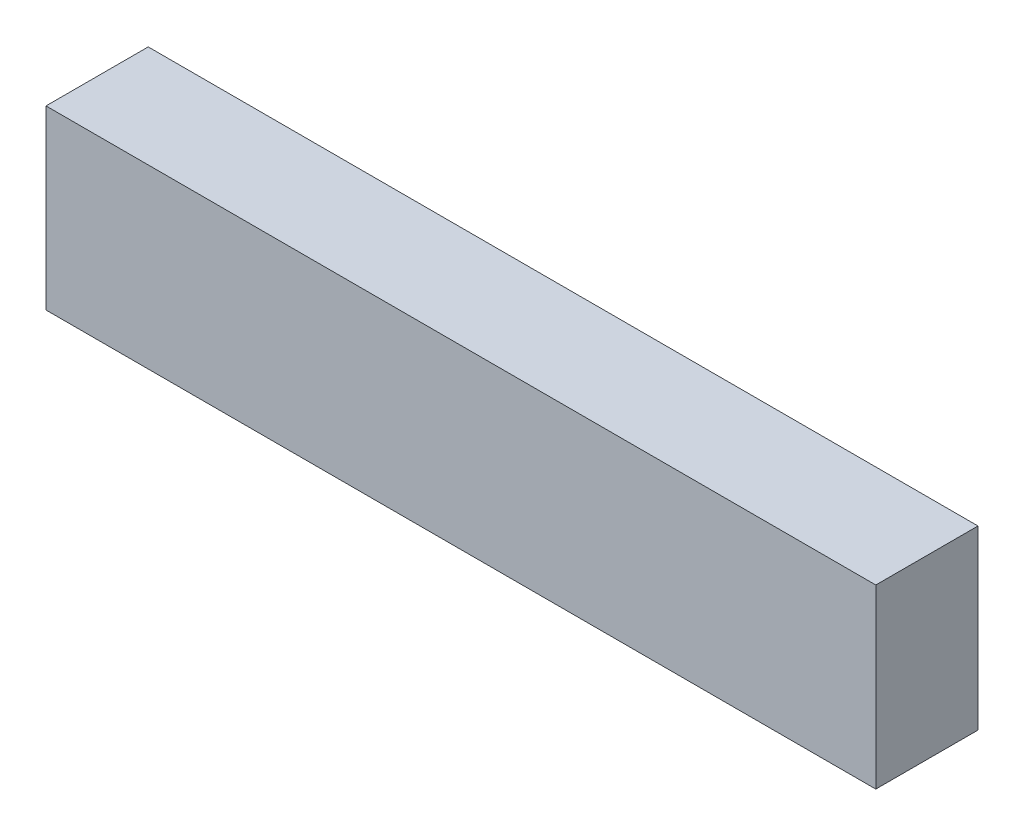
ISO-10303-21;
HEADER;
FILE_DESCRIPTION(('STEP AP214'),'2;1');
FILE_NAME('part.step','',(''),(''),'','','');
FILE_SCHEMA(('AUTOMOTIVE_DESIGN { 1 0 10303 214 1 1 1 1 }'));
ENDSEC;
DATA;
#1=APPLICATION_CONTEXT('core data for automotive mechanical design processes');
#2=APPLICATION_PROTOCOL_DEFINITION('international standard','automotive_design',2000,#1);
#3=PRODUCT_CONTEXT('',#1,'mechanical');
#4=PRODUCT('Part','Part','',(#3));
#5=PRODUCT_RELATED_PRODUCT_CATEGORY('part','',(#4));
#6=PRODUCT_DEFINITION_FORMATION('','',#4);
#7=PRODUCT_DEFINITION_CONTEXT('part definition',#1,'design');
#8=PRODUCT_DEFINITION('design','',#6,#7);
#9=PRODUCT_DEFINITION_SHAPE('','',#8);
#10=(LENGTH_UNIT() NAMED_UNIT(*) SI_UNIT(.MILLI.,.METRE.));
#11=(NAMED_UNIT(*) PLANE_ANGLE_UNIT() SI_UNIT($,.RADIAN.));
#12=(NAMED_UNIT(*) SI_UNIT($,.STERADIAN.) SOLID_ANGLE_UNIT());
#13=UNCERTAINTY_MEASURE_WITH_UNIT(LENGTH_MEASURE(1.E-05),#10,'distance_accuracy_value','');
#14=(GEOMETRIC_REPRESENTATION_CONTEXT(3) GLOBAL_UNCERTAINTY_ASSIGNED_CONTEXT((#13)) GLOBAL_UNIT_ASSIGNED_CONTEXT((#10,
#11,#12)) REPRESENTATION_CONTEXT('',''));
#15=CARTESIAN_POINT('',(0.,0.,0.));
#16=DIRECTION('',(0.,0.,1.));
#17=DIRECTION('',(1.,0.,0.));
#18=AXIS2_PLACEMENT_3D('',#15,#16,#17);
#19=CARTESIAN_POINT('',(-79.0368014902547,30.19,7.25));
#20=DIRECTION('',(1.,0.,0.));
#21=DIRECTION('',(0.,0.,-1.));
#22=AXIS2_PLACEMENT_3D('',#19,#20,#21);
#23=PLANE('',#22);
#24=DIRECTION('',(0.,-1.,0.));
#25=VECTOR('',#24,1.);
#26=CARTESIAN_POINT('',(-79.0368014902547,30.19,0.));
#27=LINE('',#26,#25);
#28=CARTESIAN_POINT('',(-79.0368014902547,30.19,0.));
#29=VERTEX_POINT('',#28);
#30=CARTESIAN_POINT('',(-79.0368014902547,17.65,0.));
#31=VERTEX_POINT('',#30);
#32=EDGE_CURVE('E149',#29,#31,#27,.T.);
#33=ORIENTED_EDGE('',*,*,#32,.T.);
#34=DIRECTION('',(0.,0.,-1.));
#35=VECTOR('',#34,1.);
#36=CARTESIAN_POINT('',(-79.0368014902547,17.65,7.25));
#37=LINE('',#36,#35);
#38=CARTESIAN_POINT('',(-79.0368014902547,17.65,7.25));
#39=VERTEX_POINT('',#38);
#40=EDGE_CURVE('E11',#39,#31,#37,.T.);
#41=ORIENTED_EDGE('',*,*,#40,.F.);
#42=DIRECTION('',(0.,-1.,0.));
#43=VECTOR('',#42,1.);
#44=CARTESIAN_POINT('',(-79.0368014902547,30.19,7.25));
#45=LINE('',#44,#43);
#46=CARTESIAN_POINT('',(-79.0368014902547,30.19,7.25));
#47=VERTEX_POINT('',#46);
#48=EDGE_CURVE('E140',#47,#39,#45,.T.);
#49=ORIENTED_EDGE('',*,*,#48,.F.);
#50=DIRECTION('',(0.,0.,-1.));
#51=VECTOR('',#50,1.);
#52=CARTESIAN_POINT('',(-79.0368014902547,30.19,7.25));
#53=LINE('',#52,#51);
#54=EDGE_CURVE('E55',#47,#29,#53,.T.);
#55=ORIENTED_EDGE('',*,*,#54,.T.);
#56=EDGE_LOOP('',(#33,#41,#49,#55));
#57=FACE_BOUND('',#56,.T.);
#58=ADVANCED_FACE('F32',(#57),#23,.F.);
#59=CARTESIAN_POINT('',(-79.0368014902547,17.65,7.25));
#60=DIRECTION('',(0.,1.,0.));
#61=DIRECTION('',(0.,0.,1.));
#62=AXIS2_PLACEMENT_3D('',#59,#60,#61);
#63=PLANE('',#62);
#64=DIRECTION('',(1.,0.,0.));
#65=VECTOR('',#64,1.);
#66=CARTESIAN_POINT('',(-79.0368014902547,17.65,0.));
#67=LINE('',#66,#65);
#68=CARTESIAN_POINT('',(-20.1754999999996,17.65,0.));
#69=VERTEX_POINT('',#68);
#70=EDGE_CURVE('E151',#31,#69,#67,.T.);
#71=ORIENTED_EDGE('',*,*,#70,.T.);
#72=DIRECTION('',(0.,0.,-1.));
#73=VECTOR('',#72,1.);
#74=CARTESIAN_POINT('',(-20.1754999999996,17.65,7.25));
#75=LINE('',#74,#73);
#76=CARTESIAN_POINT('',(-20.1754999999996,17.65,7.25));
#77=VERTEX_POINT('',#76);
#78=EDGE_CURVE('E39',#77,#69,#75,.T.);
#79=ORIENTED_EDGE('',*,*,#78,.F.);
#80=DIRECTION('',(1.,0.,0.));
#81=VECTOR('',#80,1.);
#82=CARTESIAN_POINT('',(-79.0368014902547,17.65,7.25));
#83=LINE('',#82,#81);
#84=EDGE_CURVE('E81',#39,#77,#83,.T.);
#85=ORIENTED_EDGE('',*,*,#84,.F.);
#86=ORIENTED_EDGE('',*,*,#40,.T.);
#87=EDGE_LOOP('',(#71,#79,#85,#86));
#88=FACE_BOUND('',#87,.T.);
#89=ADVANCED_FACE('F166',(#88),#63,.F.);
#90=CARTESIAN_POINT('',(-20.1754999999996,30.19,7.25));
#91=DIRECTION('',(1.,0.,0.));
#92=DIRECTION('',(0.,0.,-1.));
#93=AXIS2_PLACEMENT_3D('',#90,#91,#92);
#94=PLANE('',#93);
#95=DIRECTION('',(0.,-1.,0.));
#96=VECTOR('',#95,1.);
#97=CARTESIAN_POINT('',(-20.1754999999996,30.19,0.));
#98=LINE('',#97,#96);
#99=CARTESIAN_POINT('',(-20.1754999999996,30.19,0.));
#100=VERTEX_POINT('',#99);
#101=EDGE_CURVE('E155',#100,#69,#98,.T.);
#102=ORIENTED_EDGE('',*,*,#101,.F.);
#103=DIRECTION('',(0.,0.,-1.));
#104=VECTOR('',#103,1.);
#105=CARTESIAN_POINT('',(-20.1754999999996,30.19,7.25));
#106=LINE('',#105,#104);
#107=CARTESIAN_POINT('',(-20.1754999999996,30.19,7.25));
#108=VERTEX_POINT('',#107);
#109=EDGE_CURVE('E161',#108,#100,#106,.T.);
#110=ORIENTED_EDGE('',*,*,#109,.F.);
#111=DIRECTION('',(0.,-1.,0.));
#112=VECTOR('',#111,1.);
#113=CARTESIAN_POINT('',(-20.1754999999996,30.19,7.25));
#114=LINE('',#113,#112);
#115=EDGE_CURVE('E144',#108,#77,#114,.T.);
#116=ORIENTED_EDGE('',*,*,#115,.T.);
#117=ORIENTED_EDGE('',*,*,#78,.T.);
#118=EDGE_LOOP('',(#102,#110,#116,#117));
#119=FACE_BOUND('',#118,.T.);
#120=ADVANCED_FACE('F164',(#119),#94,.T.);
#121=CARTESIAN_POINT('',(-79.0368014902547,30.19,7.25));
#122=DIRECTION('',(0.,1.,0.));
#123=DIRECTION('',(0.,0.,1.));
#124=AXIS2_PLACEMENT_3D('',#121,#122,#123);
#125=PLANE('',#124);
#126=DIRECTION('',(1.,0.,0.));
#127=VECTOR('',#126,1.);
#128=CARTESIAN_POINT('',(-79.0368014902547,30.19,0.));
#129=LINE('',#128,#127);
#130=EDGE_CURVE('E142',#29,#100,#129,.T.);
#131=ORIENTED_EDGE('',*,*,#130,.F.);
#132=ORIENTED_EDGE('',*,*,#54,.F.);
#133=DIRECTION('',(1.,0.,0.));
#134=VECTOR('',#133,1.);
#135=CARTESIAN_POINT('',(-79.0368014902547,30.19,7.25));
#136=LINE('',#135,#134);
#137=EDGE_CURVE('E147',#47,#108,#136,.T.);
#138=ORIENTED_EDGE('',*,*,#137,.T.);
#139=ORIENTED_EDGE('',*,*,#109,.T.);
#140=EDGE_LOOP('',(#131,#132,#138,#139));
#141=FACE_BOUND('',#140,.T.);
#142=ADVANCED_FACE('F170',(#141),#125,.T.);
#143=CARTESIAN_POINT('',(0.,0.,7.25));
#144=DIRECTION('',(0.,0.,1.));
#145=DIRECTION('',(1.,0.,0.));
#146=AXIS2_PLACEMENT_3D('',#143,#144,#145);
#147=PLANE('',#146);
#148=ORIENTED_EDGE('',*,*,#48,.T.);
#149=ORIENTED_EDGE('',*,*,#84,.T.);
#150=ORIENTED_EDGE('',*,*,#115,.F.);
#151=ORIENTED_EDGE('',*,*,#137,.F.);
#152=EDGE_LOOP('',(#148,#149,#150,#151));
#153=FACE_BOUND('',#152,.T.);
#154=ADVANCED_FACE('F173',(#153),#147,.T.);
#155=CARTESIAN_POINT('',(0.,0.,0.));
#156=DIRECTION('',(0.,0.,1.));
#157=DIRECTION('',(1.,0.,0.));
#158=AXIS2_PLACEMENT_3D('',#155,#156,#157);
#159=PLANE('',#158);
#160=DIRECTION('',(1.,0.,0.));
#161=VECTOR('',#160,1.);
#162=CARTESIAN_POINT('',(-79.0368014902547,29.69,0.));
#163=LINE('',#162,#161);
#164=CARTESIAN_POINT('',(-78.5368014902547,29.69,0.));
#165=VERTEX_POINT('',#164);
#166=CARTESIAN_POINT('',(-20.6754999999996,29.69,0.));
#167=VERTEX_POINT('',#166);
#168=EDGE_CURVE('E125',#165,#167,#163,.T.);
#169=ORIENTED_EDGE('',*,*,#168,.F.);
#170=DIRECTION('',(0.,-1.,0.));
#171=VECTOR('',#170,1.);
#172=CARTESIAN_POINT('',(-78.5368014902547,30.19,0.));
#173=LINE('',#172,#171);
#174=CARTESIAN_POINT('',(-78.5368014902547,18.15,0.));
#175=VERTEX_POINT('',#174);
#176=EDGE_CURVE('E112',#165,#175,#173,.T.);
#177=ORIENTED_EDGE('',*,*,#176,.T.);
#178=DIRECTION('',(1.,0.,0.));
#179=VECTOR('',#178,1.);
#180=CARTESIAN_POINT('',(-79.0368014902547,18.15,0.));
#181=LINE('',#180,#179);
#182=CARTESIAN_POINT('',(-20.6754999999996,18.15,0.));
#183=VERTEX_POINT('',#182);
#184=EDGE_CURVE('E135',#175,#183,#181,.T.);
#185=ORIENTED_EDGE('',*,*,#184,.T.);
#186=DIRECTION('',(0.,-1.,0.));
#187=VECTOR('',#186,1.);
#188=CARTESIAN_POINT('',(-20.6754999999996,30.19,0.));
#189=LINE('',#188,#187);
#190=EDGE_CURVE('E46',#167,#183,#189,.T.);
#191=ORIENTED_EDGE('',*,*,#190,.F.);
#192=EDGE_LOOP('',(#169,#177,#185,#191));
#193=FACE_BOUND('',#192,.T.);
#194=ORIENTED_EDGE('',*,*,#32,.F.);
#195=ORIENTED_EDGE('',*,*,#130,.T.);
#196=ORIENTED_EDGE('',*,*,#101,.T.);
#197=ORIENTED_EDGE('',*,*,#70,.F.);
#198=EDGE_LOOP('',(#194,#195,#196,#197));
#199=FACE_BOUND('',#198,.T.);
#200=ADVANCED_FACE('F169',(#193,#199),#159,.F.);
#201=CARTESIAN_POINT('',(-78.5368014902547,30.19,7.25));
#202=DIRECTION('',(1.,0.,0.));
#203=DIRECTION('',(0.,0.,-1.));
#204=AXIS2_PLACEMENT_3D('',#201,#202,#203);
#205=PLANE('',#204);
#206=ORIENTED_EDGE('',*,*,#176,.F.);
#207=DIRECTION('',(0.,0.,-1.));
#208=VECTOR('',#207,1.);
#209=CARTESIAN_POINT('',(-78.5368014902547,29.69,7.25));
#210=LINE('',#209,#208);
#211=CARTESIAN_POINT('',(-78.5368014902547,29.69,7.05));
#212=VERTEX_POINT('',#211);
#213=EDGE_CURVE('E105',#212,#165,#210,.T.);
#214=ORIENTED_EDGE('',*,*,#213,.F.);
#215=DIRECTION('',(0.,-1.,0.));
#216=VECTOR('',#215,1.);
#217=CARTESIAN_POINT('',(-78.5368014902547,30.19,7.05));
#218=LINE('',#217,#216);
#219=CARTESIAN_POINT('',(-78.5368014902547,18.15,7.05));
#220=VERTEX_POINT('',#219);
#221=EDGE_CURVE('E109',#212,#220,#218,.T.);
#222=ORIENTED_EDGE('',*,*,#221,.T.);
#223=DIRECTION('',(0.,0.,-1.));
#224=VECTOR('',#223,1.);
#225=CARTESIAN_POINT('',(-78.5368014902547,18.15,7.25));
#226=LINE('',#225,#224);
#227=EDGE_CURVE('E152',#220,#175,#226,.T.);
#228=ORIENTED_EDGE('',*,*,#227,.T.);
#229=EDGE_LOOP('',(#206,#214,#222,#228));
#230=FACE_BOUND('',#229,.T.);
#231=ADVANCED_FACE('F107',(#230),#205,.T.);
#232=CARTESIAN_POINT('',(-79.0368014902547,18.15,7.25));
#233=DIRECTION('',(0.,1.,0.));
#234=DIRECTION('',(0.,0.,1.));
#235=AXIS2_PLACEMENT_3D('',#232,#233,#234);
#236=PLANE('',#235);
#237=ORIENTED_EDGE('',*,*,#184,.F.);
#238=ORIENTED_EDGE('',*,*,#227,.F.);
#239=DIRECTION('',(1.,0.,0.));
#240=VECTOR('',#239,1.);
#241=CARTESIAN_POINT('',(-79.0368014902547,18.15,7.05));
#242=LINE('',#241,#240);
#243=CARTESIAN_POINT('',(-20.6754999999996,18.15,7.05));
#244=VERTEX_POINT('',#243);
#245=EDGE_CURVE('E124',#220,#244,#242,.T.);
#246=ORIENTED_EDGE('',*,*,#245,.T.);
#247=DIRECTION('',(0.,0.,-1.));
#248=VECTOR('',#247,1.);
#249=CARTESIAN_POINT('',(-20.6754999999996,18.15,7.25));
#250=LINE('',#249,#248);
#251=EDGE_CURVE('E264',#244,#183,#250,.T.);
#252=ORIENTED_EDGE('',*,*,#251,.T.);
#253=EDGE_LOOP('',(#237,#238,#246,#252));
#254=FACE_BOUND('',#253,.T.);
#255=ADVANCED_FACE('F197',(#254),#236,.T.);
#256=CARTESIAN_POINT('',(-20.6754999999996,30.19,7.25));
#257=DIRECTION('',(1.,0.,0.));
#258=DIRECTION('',(0.,0.,-1.));
#259=AXIS2_PLACEMENT_3D('',#256,#257,#258);
#260=PLANE('',#259);
#261=ORIENTED_EDGE('',*,*,#190,.T.);
#262=ORIENTED_EDGE('',*,*,#251,.F.);
#263=DIRECTION('',(0.,-1.,0.));
#264=VECTOR('',#263,1.);
#265=CARTESIAN_POINT('',(-20.6754999999996,30.19,7.05));
#266=LINE('',#265,#264);
#267=CARTESIAN_POINT('',(-20.6754999999996,29.69,7.05));
#268=VERTEX_POINT('',#267);
#269=EDGE_CURVE('E129',#268,#244,#266,.T.);
#270=ORIENTED_EDGE('',*,*,#269,.F.);
#271=DIRECTION('',(0.,0.,-1.));
#272=VECTOR('',#271,1.);
#273=CARTESIAN_POINT('',(-20.6754999999996,29.69,7.25));
#274=LINE('',#273,#272);
#275=EDGE_CURVE('E117',#268,#167,#274,.T.);
#276=ORIENTED_EDGE('',*,*,#275,.T.);
#277=EDGE_LOOP('',(#261,#262,#270,#276));
#278=FACE_BOUND('',#277,.T.);
#279=ADVANCED_FACE('F194',(#278),#260,.F.);
#280=CARTESIAN_POINT('',(-79.0368014902547,29.69,7.25));
#281=DIRECTION('',(0.,1.,0.));
#282=DIRECTION('',(0.,0.,1.));
#283=AXIS2_PLACEMENT_3D('',#280,#281,#282);
#284=PLANE('',#283);
#285=ORIENTED_EDGE('',*,*,#168,.T.);
#286=ORIENTED_EDGE('',*,*,#275,.F.);
#287=DIRECTION('',(1.,0.,0.));
#288=VECTOR('',#287,1.);
#289=CARTESIAN_POINT('',(-79.0368014902547,29.69,7.05));
#290=LINE('',#289,#288);
#291=EDGE_CURVE('E118',#212,#268,#290,.T.);
#292=ORIENTED_EDGE('',*,*,#291,.F.);
#293=ORIENTED_EDGE('',*,*,#213,.T.);
#294=EDGE_LOOP('',(#285,#286,#292,#293));
#295=FACE_BOUND('',#294,.T.);
#296=ADVANCED_FACE('F127',(#295),#284,.F.);
#297=CARTESIAN_POINT('',(0.,0.,7.05));
#298=DIRECTION('',(0.,0.,1.));
#299=DIRECTION('',(1.,0.,0.));
#300=AXIS2_PLACEMENT_3D('',#297,#298,#299);
#301=PLANE('',#300);
#302=ORIENTED_EDGE('',*,*,#221,.F.);
#303=ORIENTED_EDGE('',*,*,#291,.T.);
#304=ORIENTED_EDGE('',*,*,#269,.T.);
#305=ORIENTED_EDGE('',*,*,#245,.F.);
#306=EDGE_LOOP('',(#302,#303,#304,#305));
#307=FACE_BOUND('',#306,.T.);
#308=ADVANCED_FACE('F122',(#307),#301,.F.);
#309=CLOSED_SHELL('',(#58,#89,#120,#142,#154,#200,#231,#255,#279,#296,#308));
#310=MANIFOLD_SOLID_BREP('B2',#309);
#311=ADVANCED_BREP_SHAPE_REPRESENTATION('',(#18,#310),#14);
#312=SHAPE_DEFINITION_REPRESENTATION(#9,#311);
ENDSEC;
END-ISO-10303-21;
